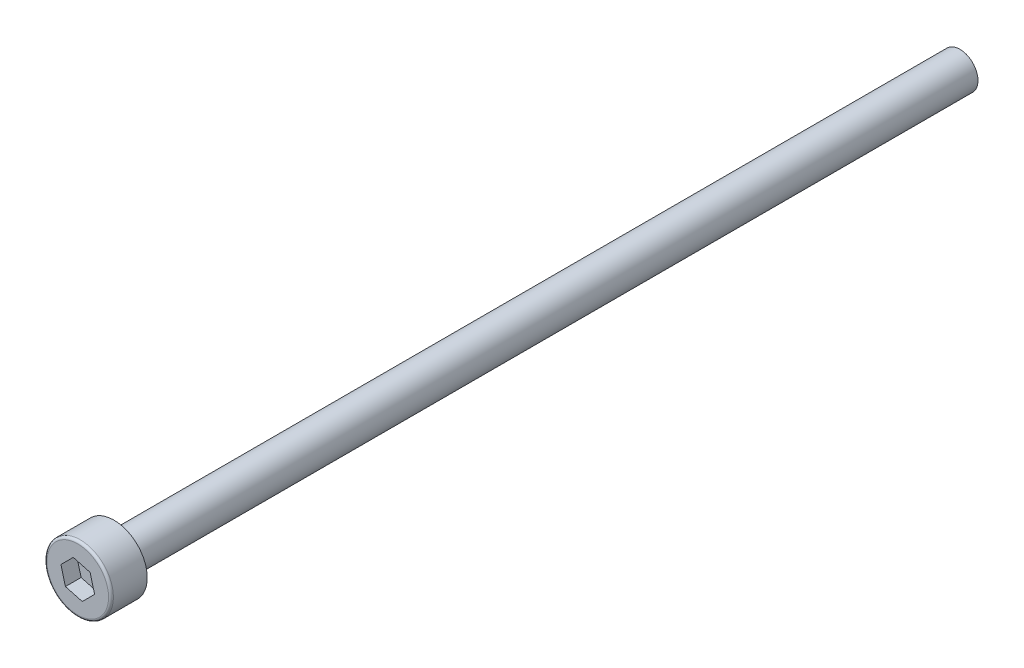
ISO-10303-21;
HEADER;
FILE_DESCRIPTION(('STEP AP214'),'2;1');
FILE_NAME('part.step','',(''),(''),'','','');
FILE_SCHEMA(('AUTOMOTIVE_DESIGN { 1 0 10303 214 1 1 1 1 }'));
ENDSEC;
DATA;
#1=APPLICATION_CONTEXT('core data for automotive mechanical design processes');
#2=APPLICATION_PROTOCOL_DEFINITION('international standard','automotive_design',2000,#1);
#3=PRODUCT_CONTEXT('',#1,'mechanical');
#4=PRODUCT('Part','Part','',(#3));
#5=PRODUCT_RELATED_PRODUCT_CATEGORY('part','',(#4));
#6=PRODUCT_DEFINITION_FORMATION('','',#4);
#7=PRODUCT_DEFINITION_CONTEXT('part definition',#1,'design');
#8=PRODUCT_DEFINITION('design','',#6,#7);
#9=PRODUCT_DEFINITION_SHAPE('','',#8);
#10=(LENGTH_UNIT() NAMED_UNIT(*) SI_UNIT(.MILLI.,.METRE.));
#11=(NAMED_UNIT(*) PLANE_ANGLE_UNIT() SI_UNIT($,.RADIAN.));
#12=(NAMED_UNIT(*) SI_UNIT($,.STERADIAN.) SOLID_ANGLE_UNIT());
#13=UNCERTAINTY_MEASURE_WITH_UNIT(LENGTH_MEASURE(1.E-05),#10,'distance_accuracy_value','');
#14=(GEOMETRIC_REPRESENTATION_CONTEXT(3) GLOBAL_UNCERTAINTY_ASSIGNED_CONTEXT((#13)) GLOBAL_UNIT_ASSIGNED_CONTEXT((#10,
#11,#12)) REPRESENTATION_CONTEXT('',''));
#15=CARTESIAN_POINT('',(0.,0.,0.));
#16=DIRECTION('',(0.,0.,1.));
#17=DIRECTION('',(1.,0.,0.));
#18=AXIS2_PLACEMENT_3D('',#15,#16,#17);
#19=CARTESIAN_POINT('',(0.,0.,0.));
#20=DIRECTION('',(0.,0.,1.));
#21=DIRECTION('',(1.,0.,0.));
#22=AXIS2_PLACEMENT_3D('',#19,#20,#21);
#23=PLANE('',#22);
#24=CARTESIAN_POINT('',(0.,0.,0.));
#25=DIRECTION('',(0.,0.,1.));
#26=DIRECTION('',(1.,0.,0.));
#27=AXIS2_PLACEMENT_3D('',#24,#25,#26);
#28=CIRCLE('',#27,2.75);
#29=CARTESIAN_POINT('',(2.75,0.,0.));
#30=VERTEX_POINT('',#29);
#31=EDGE_CURVE('E138',#30,#30,#28,.T.);
#32=ORIENTED_EDGE('',*,*,#31,.F.);
#33=EDGE_LOOP('',(#32));
#34=FACE_BOUND('',#33,.T.);
#35=CARTESIAN_POINT('',(0.,0.,0.));
#36=DIRECTION('',(0.,0.,1.));
#37=DIRECTION('',(1.,0.,0.));
#38=AXIS2_PLACEMENT_3D('',#35,#36,#37);
#39=CIRCLE('',#38,1.5);
#40=CARTESIAN_POINT('',(1.5,0.,0.));
#41=VERTEX_POINT('',#40);
#42=EDGE_CURVE('E146',#41,#41,#39,.F.);
#43=ORIENTED_EDGE('',*,*,#42,.F.);
#44=EDGE_LOOP('',(#43));
#45=FACE_BOUND('',#44,.T.);
#46=ADVANCED_FACE('F35',(#34,#45),#23,.F.);
#47=CARTESIAN_POINT('',(0.,0.,3.));
#48=DIRECTION('',(0.,0.,-1.));
#49=DIRECTION('',(-1.,0.,0.));
#50=AXIS2_PLACEMENT_3D('',#47,#48,#49);
#51=CYLINDRICAL_SURFACE('',#50,2.75);
#52=CARTESIAN_POINT('',(0.,0.,2.8));
#53=DIRECTION('',(0.,0.,1.));
#54=DIRECTION('',(1.,0.,0.));
#55=AXIS2_PLACEMENT_3D('',#52,#53,#54);
#56=CIRCLE('',#55,2.75);
#57=CARTESIAN_POINT('',(2.75,0.,2.8));
#58=VERTEX_POINT('',#57);
#59=EDGE_CURVE('E11',#58,#58,#56,.F.);
#60=ORIENTED_EDGE('',*,*,#59,.T.);
#61=EDGE_LOOP('',(#60));
#62=FACE_BOUND('',#61,.T.);
#63=ORIENTED_EDGE('',*,*,#31,.T.);
#64=EDGE_LOOP('',(#63));
#65=FACE_BOUND('',#64,.T.);
#66=ADVANCED_FACE('F165',(#62,#65),#51,.T.);
#67=CARTESIAN_POINT('',(0.,0.,3.));
#68=DIRECTION('',(0.,0.,1.));
#69=DIRECTION('',(1.,0.,0.));
#70=AXIS2_PLACEMENT_3D('',#67,#68,#69);
#71=PLANE('',#70);
#72=CARTESIAN_POINT('',(0.,0.,3.));
#73=DIRECTION('',(0.,0.,1.));
#74=DIRECTION('',(1.,0.,0.));
#75=AXIS2_PLACEMENT_3D('',#72,#73,#74);
#76=CIRCLE('',#75,2.55);
#77=CARTESIAN_POINT('',(2.55,0.,3.));
#78=VERTEX_POINT('',#77);
#79=EDGE_CURVE('E43',#78,#78,#76,.T.);
#80=ORIENTED_EDGE('',*,*,#79,.T.);
#81=EDGE_LOOP('',(#80));
#82=FACE_BOUND('',#81,.T.);
#83=DIRECTION('',(0.258819045102521,-0.965925826289068,0.));
#84=VECTOR('',#83,1.);
#85=CARTESIAN_POINT('',(-1.39419383956301,0.373573113403356,3.));
#86=LINE('',#85,#84);
#87=CARTESIAN_POINT('',(-1.39419383956301,0.373573113403356,3.));
#88=VERTEX_POINT('',#87);
#89=CARTESIAN_POINT('',(-1.02062072615966,-1.02062072615966,3.));
#90=VERTEX_POINT('',#89);
#91=EDGE_CURVE('E50',#88,#90,#86,.T.);
#92=ORIENTED_EDGE('',*,*,#91,.F.);
#93=DIRECTION('',(-0.707106781186548,-0.707106781186548,0.));
#94=VECTOR('',#93,1.);
#95=CARTESIAN_POINT('',(-0.373573113403355,1.39419383956301,3.));
#96=LINE('',#95,#94);
#97=CARTESIAN_POINT('',(-0.373573113403355,1.39419383956301,3.));
#98=VERTEX_POINT('',#97);
#99=EDGE_CURVE('E134',#98,#88,#96,.T.);
#100=ORIENTED_EDGE('',*,*,#99,.F.);
#101=DIRECTION('',(-0.965925826289068,0.258819045102521,0.));
#102=VECTOR('',#101,1.);
#103=CARTESIAN_POINT('',(1.02062072615966,1.02062072615966,3.));
#104=LINE('',#103,#102);
#105=CARTESIAN_POINT('',(1.02062072615966,1.02062072615966,3.));
#106=VERTEX_POINT('',#105);
#107=EDGE_CURVE('E132',#106,#98,#104,.T.);
#108=ORIENTED_EDGE('',*,*,#107,.F.);
#109=DIRECTION('',(-0.258819045102521,0.965925826289068,0.));
#110=VECTOR('',#109,1.);
#111=CARTESIAN_POINT('',(1.39419383956301,-0.373573113403355,3.));
#112=LINE('',#111,#110);
#113=CARTESIAN_POINT('',(1.39419383956301,-0.373573113403355,3.));
#114=VERTEX_POINT('',#113);
#115=EDGE_CURVE('E98',#114,#106,#112,.T.);
#116=ORIENTED_EDGE('',*,*,#115,.F.);
#117=DIRECTION('',(0.707106781186548,0.707106781186548,0.));
#118=VECTOR('',#117,1.);
#119=CARTESIAN_POINT('',(0.373573113403355,-1.39419383956301,3.));
#120=LINE('',#119,#118);
#121=CARTESIAN_POINT('',(0.373573113403355,-1.39419383956301,3.));
#122=VERTEX_POINT('',#121);
#123=EDGE_CURVE('E128',#122,#114,#120,.T.);
#124=ORIENTED_EDGE('',*,*,#123,.F.);
#125=DIRECTION('',(0.965925826289068,-0.258819045102521,0.));
#126=VECTOR('',#125,1.);
#127=CARTESIAN_POINT('',(-1.02062072615966,-1.02062072615966,3.));
#128=LINE('',#127,#126);
#129=EDGE_CURVE('E124',#90,#122,#128,.T.);
#130=ORIENTED_EDGE('',*,*,#129,.F.);
#131=EDGE_LOOP('',(#92,#100,#108,#116,#124,#130));
#132=FACE_BOUND('',#131,.T.);
#133=ADVANCED_FACE('F151',(#82,#132),#71,.T.);
#134=CARTESIAN_POINT('',(-1.39419383956301,0.373573113403356,1.7));
#135=DIRECTION('',(-0.965925826289068,-0.258819045102521,0.));
#136=DIRECTION('',(0.258819045102521,-0.965925826289068,0.));
#137=AXIS2_PLACEMENT_3D('',#134,#135,#136);
#138=PLANE('',#137);
#139=ORIENTED_EDGE('',*,*,#91,.T.);
#140=DIRECTION('',(0.,0.,1.));
#141=VECTOR('',#140,1.);
#142=CARTESIAN_POINT('',(-1.02062072615966,-1.02062072615966,1.7));
#143=LINE('',#142,#141);
#144=CARTESIAN_POINT('',(-1.02062072615966,-1.02062072615966,1.7));
#145=VERTEX_POINT('',#144);
#146=EDGE_CURVE('E80',#145,#90,#143,.T.);
#147=ORIENTED_EDGE('',*,*,#146,.F.);
#148=DIRECTION('',(0.258819045102521,-0.965925826289068,0.));
#149=VECTOR('',#148,1.);
#150=CARTESIAN_POINT('',(-1.39419383956301,0.373573113403356,1.7));
#151=LINE('',#150,#149);
#152=CARTESIAN_POINT('',(-1.39419383956301,0.373573113403356,1.7));
#153=VERTEX_POINT('',#152);
#154=EDGE_CURVE('E136',#153,#145,#151,.T.);
#155=ORIENTED_EDGE('',*,*,#154,.F.);
#156=DIRECTION('',(0.,0.,1.));
#157=VECTOR('',#156,1.);
#158=CARTESIAN_POINT('',(-1.39419383956301,0.373573113403356,1.7));
#159=LINE('',#158,#157);
#160=EDGE_CURVE('E58',#153,#88,#159,.T.);
#161=ORIENTED_EDGE('',*,*,#160,.T.);
#162=EDGE_LOOP('',(#139,#147,#155,#161));
#163=FACE_BOUND('',#162,.T.);
#164=ADVANCED_FACE('F177',(#163),#138,.F.);
#165=CARTESIAN_POINT('',(-0.373573113403355,1.39419383956301,1.7));
#166=DIRECTION('',(-0.707106781186548,0.707106781186548,0.));
#167=DIRECTION('',(-0.707106781186548,-0.707106781186548,0.));
#168=AXIS2_PLACEMENT_3D('',#165,#166,#167);
#169=PLANE('',#168);
#170=ORIENTED_EDGE('',*,*,#99,.T.);
#171=ORIENTED_EDGE('',*,*,#160,.F.);
#172=DIRECTION('',(-0.707106781186548,-0.707106781186548,0.));
#173=VECTOR('',#172,1.);
#174=CARTESIAN_POINT('',(-0.373573113403355,1.39419383956301,1.7));
#175=LINE('',#174,#173);
#176=CARTESIAN_POINT('',(-0.373573113403355,1.39419383956301,1.7));
#177=VERTEX_POINT('',#176);
#178=EDGE_CURVE('E110',#177,#153,#175,.T.);
#179=ORIENTED_EDGE('',*,*,#178,.F.);
#180=DIRECTION('',(0.,0.,1.));
#181=VECTOR('',#180,1.);
#182=CARTESIAN_POINT('',(-0.373573113403355,1.39419383956301,1.7));
#183=LINE('',#182,#181);
#184=EDGE_CURVE('E102',#177,#98,#183,.T.);
#185=ORIENTED_EDGE('',*,*,#184,.T.);
#186=EDGE_LOOP('',(#170,#171,#179,#185));
#187=FACE_BOUND('',#186,.T.);
#188=ADVANCED_FACE('F180',(#187),#169,.F.);
#189=CARTESIAN_POINT('',(1.02062072615966,1.02062072615966,1.7));
#190=DIRECTION('',(0.258819045102521,0.965925826289068,0.));
#191=DIRECTION('',(-0.965925826289068,0.258819045102521,0.));
#192=AXIS2_PLACEMENT_3D('',#189,#190,#191);
#193=PLANE('',#192);
#194=ORIENTED_EDGE('',*,*,#107,.T.);
#195=ORIENTED_EDGE('',*,*,#184,.F.);
#196=DIRECTION('',(-0.965925826289068,0.258819045102521,0.));
#197=VECTOR('',#196,1.);
#198=CARTESIAN_POINT('',(1.02062072615966,1.02062072615966,1.7));
#199=LINE('',#198,#197);
#200=CARTESIAN_POINT('',(1.02062072615966,1.02062072615966,1.7));
#201=VERTEX_POINT('',#200);
#202=EDGE_CURVE('E106',#201,#177,#199,.T.);
#203=ORIENTED_EDGE('',*,*,#202,.F.);
#204=DIRECTION('',(0.,0.,1.));
#205=VECTOR('',#204,1.);
#206=CARTESIAN_POINT('',(1.02062072615966,1.02062072615966,1.7));
#207=LINE('',#206,#205);
#208=EDGE_CURVE('E91',#201,#106,#207,.T.);
#209=ORIENTED_EDGE('',*,*,#208,.T.);
#210=EDGE_LOOP('',(#194,#195,#203,#209));
#211=FACE_BOUND('',#210,.T.);
#212=ADVANCED_FACE('F107',(#211),#193,.F.);
#213=CARTESIAN_POINT('',(1.39419383956301,-0.373573113403355,1.7));
#214=DIRECTION('',(0.965925826289068,0.258819045102521,0.));
#215=DIRECTION('',(-0.258819045102521,0.965925826289068,0.));
#216=AXIS2_PLACEMENT_3D('',#213,#214,#215);
#217=PLANE('',#216);
#218=ORIENTED_EDGE('',*,*,#115,.T.);
#219=ORIENTED_EDGE('',*,*,#208,.F.);
#220=DIRECTION('',(-0.258819045102521,0.965925826289068,0.));
#221=VECTOR('',#220,1.);
#222=CARTESIAN_POINT('',(1.39419383956301,-0.373573113403355,1.7));
#223=LINE('',#222,#221);
#224=CARTESIAN_POINT('',(1.39419383956301,-0.373573113403355,1.7));
#225=VERTEX_POINT('',#224);
#226=EDGE_CURVE('E95',#225,#201,#223,.T.);
#227=ORIENTED_EDGE('',*,*,#226,.F.);
#228=DIRECTION('',(0.,0.,1.));
#229=VECTOR('',#228,1.);
#230=CARTESIAN_POINT('',(1.39419383956301,-0.373573113403355,1.7));
#231=LINE('',#230,#229);
#232=EDGE_CURVE('E103',#225,#114,#231,.T.);
#233=ORIENTED_EDGE('',*,*,#232,.T.);
#234=EDGE_LOOP('',(#218,#219,#227,#233));
#235=FACE_BOUND('',#234,.T.);
#236=ADVANCED_FACE('F93',(#235),#217,.F.);
#237=CARTESIAN_POINT('',(0.373573113403355,-1.39419383956301,1.7));
#238=DIRECTION('',(0.707106781186548,-0.707106781186548,0.));
#239=DIRECTION('',(0.707106781186548,0.707106781186548,0.));
#240=AXIS2_PLACEMENT_3D('',#237,#238,#239);
#241=PLANE('',#240);
#242=ORIENTED_EDGE('',*,*,#123,.T.);
#243=ORIENTED_EDGE('',*,*,#232,.F.);
#244=DIRECTION('',(0.707106781186548,0.707106781186548,0.));
#245=VECTOR('',#244,1.);
#246=CARTESIAN_POINT('',(0.373573113403355,-1.39419383956301,1.7));
#247=LINE('',#246,#245);
#248=CARTESIAN_POINT('',(0.373573113403355,-1.39419383956301,1.7));
#249=VERTEX_POINT('',#248);
#250=EDGE_CURVE('E116',#249,#225,#247,.T.);
#251=ORIENTED_EDGE('',*,*,#250,.F.);
#252=DIRECTION('',(0.,0.,1.));
#253=VECTOR('',#252,1.);
#254=CARTESIAN_POINT('',(0.373573113403355,-1.39419383956301,1.7));
#255=LINE('',#254,#253);
#256=EDGE_CURVE('E141',#249,#122,#255,.T.);
#257=ORIENTED_EDGE('',*,*,#256,.T.);
#258=EDGE_LOOP('',(#242,#243,#251,#257));
#259=FACE_BOUND('',#258,.T.);
#260=ADVANCED_FACE('F184',(#259),#241,.F.);
#261=CARTESIAN_POINT('',(-1.02062072615966,-1.02062072615966,1.7));
#262=DIRECTION('',(-0.258819045102521,-0.965925826289068,0.));
#263=DIRECTION('',(0.965925826289068,-0.258819045102521,0.));
#264=AXIS2_PLACEMENT_3D('',#261,#262,#263);
#265=PLANE('',#264);
#266=ORIENTED_EDGE('',*,*,#129,.T.);
#267=ORIENTED_EDGE('',*,*,#256,.F.);
#268=DIRECTION('',(0.965925826289068,-0.258819045102521,0.));
#269=VECTOR('',#268,1.);
#270=CARTESIAN_POINT('',(-1.02062072615966,-1.02062072615966,1.7));
#271=LINE('',#270,#269);
#272=EDGE_CURVE('E118',#145,#249,#271,.T.);
#273=ORIENTED_EDGE('',*,*,#272,.F.);
#274=ORIENTED_EDGE('',*,*,#146,.T.);
#275=EDGE_LOOP('',(#266,#267,#273,#274));
#276=FACE_BOUND('',#275,.T.);
#277=ADVANCED_FACE('F181',(#276),#265,.F.);
#278=CARTESIAN_POINT('',(0.,0.,1.7));
#279=DIRECTION('',(0.,0.,1.));
#280=DIRECTION('',(1.,0.,0.));
#281=AXIS2_PLACEMENT_3D('',#278,#279,#280);
#282=PLANE('',#281);
#283=ORIENTED_EDGE('',*,*,#154,.T.);
#284=ORIENTED_EDGE('',*,*,#272,.T.);
#285=ORIENTED_EDGE('',*,*,#250,.T.);
#286=ORIENTED_EDGE('',*,*,#226,.T.);
#287=ORIENTED_EDGE('',*,*,#202,.T.);
#288=ORIENTED_EDGE('',*,*,#178,.T.);
#289=EDGE_LOOP('',(#283,#284,#285,#286,#287,#288));
#290=FACE_BOUND('',#289,.T.);
#291=ADVANCED_FACE('F113',(#290),#282,.T.);
#292=CARTESIAN_POINT('',(0.,0.,-70.));
#293=DIRECTION('',(0.,0.,1.));
#294=DIRECTION('',(1.,0.,0.));
#295=AXIS2_PLACEMENT_3D('',#292,#293,#294);
#296=CYLINDRICAL_SURFACE('',#295,1.5);
#297=CARTESIAN_POINT('',(0.,0.,-70.));
#298=DIRECTION('',(0.,0.,-1.));
#299=DIRECTION('',(-1.,0.,0.));
#300=AXIS2_PLACEMENT_3D('',#297,#298,#299);
#301=CIRCLE('',#300,1.5);
#302=CARTESIAN_POINT('',(-1.5,0.,-70.));
#303=VERTEX_POINT('',#302);
#304=EDGE_CURVE('E125',#303,#303,#301,.T.);
#305=ORIENTED_EDGE('',*,*,#304,.F.);
#306=EDGE_LOOP('',(#305));
#307=FACE_BOUND('',#306,.T.);
#308=ORIENTED_EDGE('',*,*,#42,.T.);
#309=EDGE_LOOP('',(#308));
#310=FACE_BOUND('',#309,.T.);
#311=ADVANCED_FACE('F160',(#307,#310),#296,.T.);
#312=CARTESIAN_POINT('',(0.,0.,-70.));
#313=DIRECTION('',(0.,0.,-1.));
#314=DIRECTION('',(-1.,0.,0.));
#315=AXIS2_PLACEMENT_3D('',#312,#313,#314);
#316=PLANE('',#315);
#317=ORIENTED_EDGE('',*,*,#304,.T.);
#318=EDGE_LOOP('',(#317));
#319=FACE_BOUND('',#318,.T.);
#320=ADVANCED_FACE('F155',(#319),#316,.T.);
#321=CARTESIAN_POINT('',(0.,0.,2.8));
#322=DIRECTION('',(0.,0.,1.));
#323=DIRECTION('',(1.,0.,0.));
#324=AXIS2_PLACEMENT_3D('',#321,#322,#323);
#325=TOROIDAL_SURFACE('',#324,2.55,0.2);
#326=ORIENTED_EDGE('',*,*,#59,.F.);
#327=EDGE_LOOP('',(#326));
#328=FACE_BOUND('',#327,.T.);
#329=ORIENTED_EDGE('',*,*,#79,.F.);
#330=EDGE_LOOP('',(#329));
#331=FACE_BOUND('',#330,.T.);
#332=ADVANCED_FACE('F37',(#328,#331),#325,.T.);
#333=CLOSED_SHELL('',(#46,#66,#133,#164,#188,#212,#236,#260,#277,#291,#311,#320,#332));
#334=MANIFOLD_SOLID_BREP('B2',#333);
#335=ADVANCED_BREP_SHAPE_REPRESENTATION('',(#18,#334),#14);
#336=SHAPE_DEFINITION_REPRESENTATION(#9,#335);
ENDSEC;
END-ISO-10303-21;
